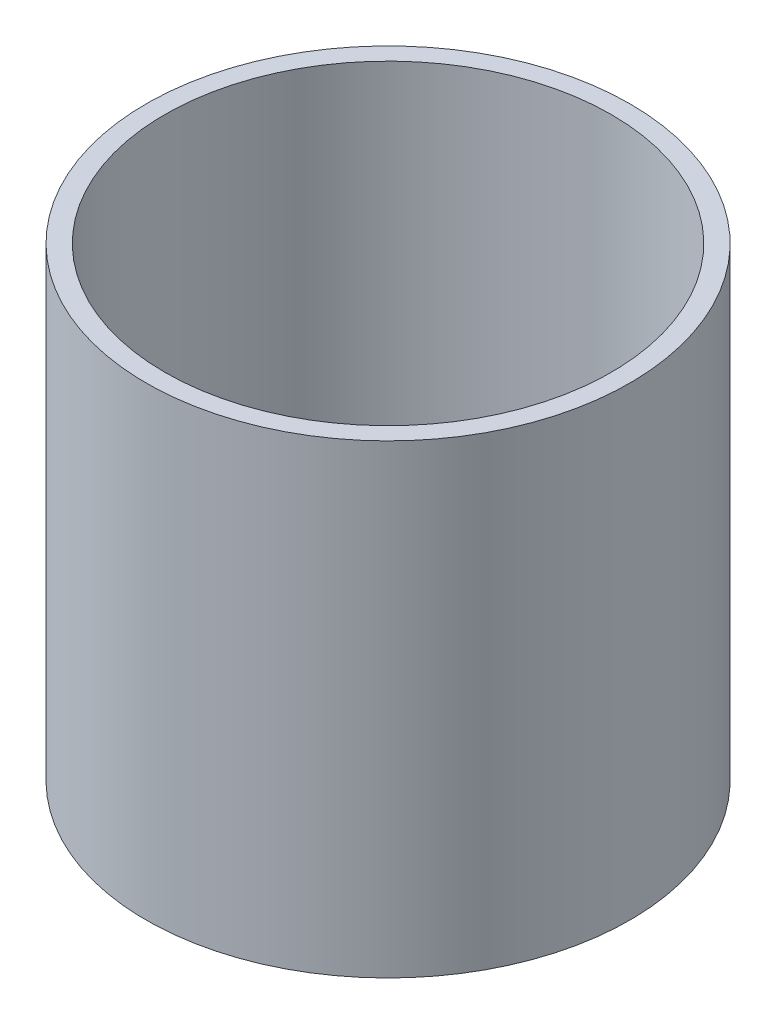
ISO-10303-21;
HEADER;
FILE_DESCRIPTION(('STEP AP214'),'2;1');
FILE_NAME('part.step','',(''),(''),'','','');
FILE_SCHEMA(('AUTOMOTIVE_DESIGN { 1 0 10303 214 1 1 1 1 }'));
ENDSEC;
DATA;
#1=APPLICATION_CONTEXT('core data for automotive mechanical design processes');
#2=APPLICATION_PROTOCOL_DEFINITION('international standard','automotive_design',2000,#1);
#3=PRODUCT_CONTEXT('',#1,'mechanical');
#4=PRODUCT('Part','Part','',(#3));
#5=PRODUCT_RELATED_PRODUCT_CATEGORY('part','',(#4));
#6=PRODUCT_DEFINITION_FORMATION('','',#4);
#7=PRODUCT_DEFINITION_CONTEXT('part definition',#1,'design');
#8=PRODUCT_DEFINITION('design','',#6,#7);
#9=PRODUCT_DEFINITION_SHAPE('','',#8);
#10=(LENGTH_UNIT() NAMED_UNIT(*) SI_UNIT(.MILLI.,.METRE.));
#11=(NAMED_UNIT(*) PLANE_ANGLE_UNIT() SI_UNIT($,.RADIAN.));
#12=(NAMED_UNIT(*) SI_UNIT($,.STERADIAN.) SOLID_ANGLE_UNIT());
#13=UNCERTAINTY_MEASURE_WITH_UNIT(LENGTH_MEASURE(1.E-05),#10,'distance_accuracy_value','');
#14=(GEOMETRIC_REPRESENTATION_CONTEXT(3) GLOBAL_UNCERTAINTY_ASSIGNED_CONTEXT((#13)) GLOBAL_UNIT_ASSIGNED_CONTEXT((#10,
#11,#12)) REPRESENTATION_CONTEXT('',''));
#15=CARTESIAN_POINT('',(0.,0.,0.));
#16=DIRECTION('',(0.,0.,1.));
#17=DIRECTION('',(1.,0.,0.));
#18=AXIS2_PLACEMENT_3D('',#15,#16,#17);
#19=CARTESIAN_POINT('',(0.,58.1915537161149,0.));
#20=DIRECTION('',(0.,-1.,0.));
#21=DIRECTION('',(0.,0.,-1.));
#22=AXIS2_PLACEMENT_3D('',#19,#20,#21);
#23=CYLINDRICAL_SURFACE('',#22,25.4);
#24=CARTESIAN_POINT('',(0.,58.1915537161149,0.));
#25=DIRECTION('',(0.,1.,0.));
#26=DIRECTION('',(0.,0.,1.));
#27=AXIS2_PLACEMENT_3D('',#24,#25,#26);
#28=CIRCLE('',#27,25.4);
#29=CARTESIAN_POINT('',(0.,58.1915537161149,-25.4));
#30=VERTEX_POINT('',#29);
#31=EDGE_CURVE('E10',#30,#30,#28,.T.);
#32=CARTESIAN_POINT('',(0.,9.345399869961,0.));
#33=DIRECTION('',(0.,1.,0.));
#34=DIRECTION('',(0.,0.,1.));
#35=AXIS2_PLACEMENT_3D('',#32,#33,#34);
#36=CIRCLE('',#35,25.4);
#37=CARTESIAN_POINT('',(0.,9.345399869961,-25.4));
#38=VERTEX_POINT('',#37);
#39=EDGE_CURVE('E41',#38,#38,#36,.T.);
#40=CARTESIAN_POINT('',(0.,58.1915537161149,-25.4));
#41=CARTESIAN_POINT('',(0.,57.6827396135508,-25.4));
#42=CARTESIAN_POINT('',(0.,57.1739255109866,-25.4));
#43=CARTESIAN_POINT('',(0.,56.1562973058584,-25.4));
#44=CARTESIAN_POINT('',(0.,55.6474832032943,-25.4));
#45=CARTESIAN_POINT('',(0.,54.6298549981661,-25.4));
#46=CARTESIAN_POINT('',(0.,54.121040895602,-25.4));
#47=CARTESIAN_POINT('',(0.,53.1034126904738,-25.4));
#48=CARTESIAN_POINT('',(0.,52.5945985879097,-25.4));
#49=CARTESIAN_POINT('',(0.,51.5769703827815,-25.4));
#50=CARTESIAN_POINT('',(0.,51.0681562802174,-25.4));
#51=CARTESIAN_POINT('',(0.,50.0505280750892,-25.4));
#52=CARTESIAN_POINT('',(0.,49.5417139725251,-25.4));
#53=CARTESIAN_POINT('',(0.,48.5240857673969,-25.4));
#54=CARTESIAN_POINT('',(0.,48.0152716648328,-25.4));
#55=CARTESIAN_POINT('',(0.,46.9976434597046,-25.4));
#56=CARTESIAN_POINT('',(0.,46.4888293571405,-25.4));
#57=CARTESIAN_POINT('',(0.,45.4712011520123,-25.4));
#58=CARTESIAN_POINT('',(0.,44.9623870494482,-25.4));
#59=CARTESIAN_POINT('',(0.,43.94475884432,-25.4));
#60=CARTESIAN_POINT('',(0.,43.4359447417559,-25.4));
#61=CARTESIAN_POINT('',(0.,42.4183165366277,-25.4));
#62=CARTESIAN_POINT('',(0.,41.9095024340636,-25.4));
#63=CARTESIAN_POINT('',(0.,40.8918742289354,-25.4));
#64=CARTESIAN_POINT('',(0.,40.3830601263713,-25.4));
#65=CARTESIAN_POINT('',(0.,39.3654319212431,-25.4));
#66=CARTESIAN_POINT('',(0.,38.856617818679,-25.4));
#67=CARTESIAN_POINT('',(0.,37.8389896135508,-25.4));
#68=CARTESIAN_POINT('',(0.,37.3301755109866,-25.4));
#69=CARTESIAN_POINT('',(0.,36.3125473058584,-25.4));
#70=CARTESIAN_POINT('',(0.,35.8037332032943,-25.4));
#71=CARTESIAN_POINT('',(0.,34.7861049981661,-25.4));
#72=CARTESIAN_POINT('',(0.,34.277290895602,-25.4));
#73=CARTESIAN_POINT('',(0.,33.2596626904738,-25.4));
#74=CARTESIAN_POINT('',(0.,32.7508485879097,-25.4));
#75=CARTESIAN_POINT('',(0.,31.7332203827815,-25.4));
#76=CARTESIAN_POINT('',(0.,31.2244062802174,-25.4));
#77=CARTESIAN_POINT('',(0.,30.2067780750892,-25.4));
#78=CARTESIAN_POINT('',(0.,29.6979639725251,-25.4));
#79=CARTESIAN_POINT('',(0.,28.6803357673969,-25.4));
#80=CARTESIAN_POINT('',(0.,28.1715216648328,-25.4));
#81=CARTESIAN_POINT('',(0.,27.1538934597046,-25.4));
#82=CARTESIAN_POINT('',(0.,26.6450793571405,-25.4));
#83=CARTESIAN_POINT('',(0.,25.6274511520123,-25.4));
#84=CARTESIAN_POINT('',(0.,25.1186370494482,-25.4));
#85=CARTESIAN_POINT('',(0.,24.10100884432,-25.4));
#86=CARTESIAN_POINT('',(0.,23.5921947417559,-25.4));
#87=CARTESIAN_POINT('',(0.,22.5745665366277,-25.4));
#88=CARTESIAN_POINT('',(0.,22.0657524340636,-25.4));
#89=CARTESIAN_POINT('',(0.,21.0481242289354,-25.4));
#90=CARTESIAN_POINT('',(0.,20.5393101263713,-25.4));
#91=CARTESIAN_POINT('',(0.,19.5216819212431,-25.4));
#92=CARTESIAN_POINT('',(0.,19.012867818679,-25.4));
#93=CARTESIAN_POINT('',(0.,17.9952396135508,-25.4));
#94=CARTESIAN_POINT('',(0.,17.4864255109866,-25.4));
#95=CARTESIAN_POINT('',(0.,16.4687973058584,-25.4));
#96=CARTESIAN_POINT('',(0.,15.9599832032943,-25.4));
#97=CARTESIAN_POINT('',(0.,14.9423549981661,-25.4));
#98=CARTESIAN_POINT('',(0.,14.433540895602,-25.4));
#99=CARTESIAN_POINT('',(0.,13.4159126904738,-25.4));
#100=CARTESIAN_POINT('',(0.,12.9070985879097,-25.4));
#101=CARTESIAN_POINT('',(0.,11.8894703827815,-25.4));
#102=CARTESIAN_POINT('',(0.,11.3806562802174,-25.4));
#103=CARTESIAN_POINT('',(0.,10.3630280750892,-25.4));
#104=CARTESIAN_POINT('',(0.,9.8542139725251,-25.4));
#105=CARTESIAN_POINT('',(0.,9.345399869961,-25.4));
#106=B_SPLINE_CURVE_WITH_KNOTS('',3,(#40,#41,#42,#43,#44,#45,#46,#47,#48,#49,#50,#51,#52,#53,
#54,#55,#56,#57,#58,#59,#60,#61,#62,#63,#64,#65,#66,#67,#68,#69,#70,#71,#72,#73,#74,#75,#76,#77,
#78,#79,#80,#81,#82,#83,#84,#85,#86,#87,#88,#89,#90,#91,#92,#93,#94,#95,#96,#97,#98,#99,#100,
#101,#102,#103,#104,#105),.UNSPECIFIED.,.F.,.F.,(4,2,2,2,2,2,2,2,2,2,2,2,2,2,2,2,2,2,2,2,2,2,2,
2,2,2,2,2,2,2,2,2,4),(0.,1.52644230769231,3.05288461538462,4.57932692307693,6.10576923076923,
7.63221153846155,9.15865384615385,10.6850961538462,12.2115384615385,13.7379807692308,
15.2644230769231,16.7908653846154,18.3173076923077,19.84375,21.3701923076923,22.8966346153846,
24.4230769230769,25.9495192307692,27.4759615384615,29.0024038461539,30.5288461538462,
32.0552884615385,33.5817307692308,35.1081730769231,36.6346153846154,38.1610576923077,39.6875,
41.2139423076923,42.7403846153846,44.2668269230769,45.7932692307692,47.3197115384615,
48.8461538461539),.UNSPECIFIED.);
#107=EDGE_CURVE('BSEAM34',#30,#38,#106,.T.);
#108=ORIENTED_EDGE('',*,*,#31,.F.);
#109=ORIENTED_EDGE('',*,*,#39,.T.);
#110=ORIENTED_EDGE('',*,*,#107,.T.);
#111=ORIENTED_EDGE('',*,*,#107,.F.);
#112=EDGE_LOOP('',(#108,#110,#109,#111));
#113=FACE_BOUND('',#112,.T.);
#114=ADVANCED_FACE('F34',(#113),#23,.T.);
#115=CARTESIAN_POINT('',(0.,58.1915537161149,0.));
#116=DIRECTION('',(0.,1.,0.));
#117=DIRECTION('',(0.,0.,1.));
#118=AXIS2_PLACEMENT_3D('',#115,#116,#117);
#119=PLANE('',#118);
#120=CARTESIAN_POINT('',(0.,58.1915537161149,0.));
#121=DIRECTION('',(0.,1.,0.));
#122=DIRECTION('',(0.,0.,1.));
#123=AXIS2_PLACEMENT_3D('',#120,#121,#122);
#124=CIRCLE('',#123,23.4461538461538);
#125=CARTESIAN_POINT('',(0.,58.1915537161149,-23.4461538461538));
#126=VERTEX_POINT('',#125);
#127=EDGE_CURVE('E45',#126,#126,#124,.T.);
#128=ORIENTED_EDGE('',*,*,#127,.F.);
#129=EDGE_LOOP('',(#128));
#130=FACE_BOUND('',#129,.T.);
#131=ORIENTED_EDGE('',*,*,#31,.T.);
#132=EDGE_LOOP('',(#131));
#133=FACE_BOUND('',#132,.T.);
#134=ADVANCED_FACE('F66',(#130,#133),#119,.T.);
#135=CARTESIAN_POINT('',(0.,9.345399869961,0.));
#136=DIRECTION('',(0.,1.,0.));
#137=DIRECTION('',(0.,0.,1.));
#138=AXIS2_PLACEMENT_3D('',#135,#136,#137);
#139=PLANE('',#138);
#140=ORIENTED_EDGE('',*,*,#39,.F.);
#141=EDGE_LOOP('',(#140));
#142=FACE_BOUND('',#141,.T.);
#143=ADVANCED_FACE('F36',(#142),#139,.F.);
#144=CARTESIAN_POINT('',(0.,58.1915537161149,0.));
#145=DIRECTION('',(0.,-1.,0.));
#146=DIRECTION('',(0.,0.,-1.));
#147=AXIS2_PLACEMENT_3D('',#144,#145,#146);
#148=CYLINDRICAL_SURFACE('',#147,23.4461538461538);
#149=CARTESIAN_POINT('',(0.,11.2992460238072,0.));
#150=DIRECTION('',(0.,1.,0.));
#151=DIRECTION('',(0.,0.,1.));
#152=AXIS2_PLACEMENT_3D('',#149,#150,#151);
#153=CIRCLE('',#152,23.4461538461538);
#154=CARTESIAN_POINT('',(0.,11.2992460238072,-23.4461538461538));
#155=VERTEX_POINT('',#154);
#156=EDGE_CURVE('E49',#155,#155,#153,.T.);
#157=CARTESIAN_POINT('',(0.,58.1915537161149,-23.4461538461538));
#158=CARTESIAN_POINT('',(0.,57.7030921776533,-23.4461538461538));
#159=CARTESIAN_POINT('',(0.,57.2146306391918,-23.4461538461538));
#160=CARTESIAN_POINT('',(0.,56.2377075622687,-23.4461538461538));
#161=CARTESIAN_POINT('',(0.,55.7492460238072,-23.4461538461538));
#162=CARTESIAN_POINT('',(0.,54.7723229468841,-23.4461538461538));
#163=CARTESIAN_POINT('',(0.,54.2838614084225,-23.4461538461538));
#164=CARTESIAN_POINT('',(0.,53.3069383314995,-23.4461538461538));
#165=CARTESIAN_POINT('',(0.,52.8184767930379,-23.4461538461538));
#166=CARTESIAN_POINT('',(0.,51.8415537161149,-23.4461538461538));
#167=CARTESIAN_POINT('',(0.,51.3530921776533,-23.4461538461538));
#168=CARTESIAN_POINT('',(0.,50.3761691007302,-23.4461538461538));
#169=CARTESIAN_POINT('',(0.,49.8877075622687,-23.4461538461538));
#170=CARTESIAN_POINT('',(0.,48.9107844853456,-23.4461538461538));
#171=CARTESIAN_POINT('',(0.,48.4223229468841,-23.4461538461538));
#172=CARTESIAN_POINT('',(0.,47.445399869961,-23.4461538461538));
#173=CARTESIAN_POINT('',(0.,46.9569383314995,-23.4461538461538));
#174=CARTESIAN_POINT('',(0.,45.9800152545764,-23.4461538461538));
#175=CARTESIAN_POINT('',(0.,45.4915537161149,-23.4461538461538));
#176=CARTESIAN_POINT('',(0.,44.5146306391918,-23.4461538461538));
#177=CARTESIAN_POINT('',(0.,44.0261691007302,-23.4461538461538));
#178=CARTESIAN_POINT('',(0.,43.0492460238072,-23.4461538461538));
#179=CARTESIAN_POINT('',(0.,42.5607844853456,-23.4461538461538));
#180=CARTESIAN_POINT('',(0.,41.5838614084225,-23.4461538461538));
#181=CARTESIAN_POINT('',(0.,41.095399869961,-23.4461538461538));
#182=CARTESIAN_POINT('',(0.,40.1184767930379,-23.4461538461538));
#183=CARTESIAN_POINT('',(0.,39.6300152545764,-23.4461538461538));
#184=CARTESIAN_POINT('',(0.,38.6530921776533,-23.4461538461538));
#185=CARTESIAN_POINT('',(0.,38.1646306391918,-23.4461538461538));
#186=CARTESIAN_POINT('',(0.,37.1877075622687,-23.4461538461538));
#187=CARTESIAN_POINT('',(0.,36.6992460238072,-23.4461538461538));
#188=CARTESIAN_POINT('',(0.,35.7223229468841,-23.4461538461538));
#189=CARTESIAN_POINT('',(0.,35.2338614084225,-23.4461538461538));
#190=CARTESIAN_POINT('',(0.,34.2569383314995,-23.4461538461538));
#191=CARTESIAN_POINT('',(0.,33.7684767930379,-23.4461538461538));
#192=CARTESIAN_POINT('',(0.,32.7915537161148,-23.4461538461538));
#193=CARTESIAN_POINT('',(0.,32.3030921776533,-23.4461538461538));
#194=CARTESIAN_POINT('',(0.,31.3261691007302,-23.4461538461538));
#195=CARTESIAN_POINT('',(0.,30.8377075622687,-23.4461538461538));
#196=CARTESIAN_POINT('',(0.,29.8607844853456,-23.4461538461538));
#197=CARTESIAN_POINT('',(0.,29.3723229468841,-23.4461538461538));
#198=CARTESIAN_POINT('',(0.,28.395399869961,-23.4461538461538));
#199=CARTESIAN_POINT('',(0.,27.9069383314995,-23.4461538461538));
#200=CARTESIAN_POINT('',(0.,26.9300152545764,-23.4461538461538));
#201=CARTESIAN_POINT('',(0.,26.4415537161148,-23.4461538461538));
#202=CARTESIAN_POINT('',(0.,25.4646306391918,-23.4461538461538));
#203=CARTESIAN_POINT('',(0.,24.9761691007302,-23.4461538461538));
#204=CARTESIAN_POINT('',(0.,23.9992460238072,-23.4461538461538));
#205=CARTESIAN_POINT('',(0.,23.5107844853456,-23.4461538461538));
#206=CARTESIAN_POINT('',(0.,22.5338614084225,-23.4461538461538));
#207=CARTESIAN_POINT('',(0.,22.045399869961,-23.4461538461538));
#208=CARTESIAN_POINT('',(0.,21.0684767930379,-23.4461538461538));
#209=CARTESIAN_POINT('',(0.,20.5800152545764,-23.4461538461538));
#210=CARTESIAN_POINT('',(0.,19.6030921776533,-23.4461538461538));
#211=CARTESIAN_POINT('',(0.,19.1146306391918,-23.4461538461538));
#212=CARTESIAN_POINT('',(0.,18.1377075622687,-23.4461538461538));
#213=CARTESIAN_POINT('',(0.,17.6492460238072,-23.4461538461538));
#214=CARTESIAN_POINT('',(0.,16.6723229468841,-23.4461538461538));
#215=CARTESIAN_POINT('',(0.,16.1838614084225,-23.4461538461538));
#216=CARTESIAN_POINT('',(0.,15.2069383314995,-23.4461538461538));
#217=CARTESIAN_POINT('',(0.,14.7184767930379,-23.4461538461538));
#218=CARTESIAN_POINT('',(0.,13.7415537161149,-23.4461538461538));
#219=CARTESIAN_POINT('',(0.,13.2530921776533,-23.4461538461538));
#220=CARTESIAN_POINT('',(0.,12.2761691007302,-23.4461538461538));
#221=CARTESIAN_POINT('',(0.,11.7877075622687,-23.4461538461538));
#222=CARTESIAN_POINT('',(0.,11.2992460238072,-23.4461538461538));
#223=B_SPLINE_CURVE_WITH_KNOTS('',3,(#157,#158,#159,#160,#161,#162,#163,#164,#165,#166,#167,
#168,#169,#170,#171,#172,#173,#174,#175,#176,#177,#178,#179,#180,#181,#182,#183,#184,#185,#186,
#187,#188,#189,#190,#191,#192,#193,#194,#195,#196,#197,#198,#199,#200,#201,#202,#203,#204,#205,
#206,#207,#208,#209,#210,#211,#212,#213,#214,#215,#216,#217,#218,#219,#220,#221,#222),
.UNSPECIFIED.,.F.,.F.,(4,2,2,2,2,2,2,2,2,2,2,2,2,2,2,2,2,2,2,2,2,2,2,2,2,2,2,2,2,2,2,2,4),(0.,
1.46538461538462,2.93076923076924,4.39615384615385,5.86153846153847,7.32692307692308,
8.7923076923077,10.2576923076923,11.7230769230769,13.1884615384615,14.6538461538462,
16.1192307692308,17.5846153846154,19.05,20.5153846153846,21.9807692307692,23.4461538461539,
24.9115384615385,26.3769230769231,27.8423076923077,29.3076923076923,30.7730769230769,
32.2384615384615,33.7038461538462,35.1692307692308,36.6346153846154,38.1,39.5653846153846,
41.0307692307692,42.4961538461539,43.9615384615385,45.4269230769231,46.8923076923077),.UNSPECIFIED.);
#224=EDGE_CURVE('BSEAM57',#126,#155,#223,.T.);
#225=ORIENTED_EDGE('',*,*,#127,.T.);
#226=ORIENTED_EDGE('',*,*,#156,.F.);
#227=ORIENTED_EDGE('',*,*,#224,.T.);
#228=ORIENTED_EDGE('',*,*,#224,.F.);
#229=EDGE_LOOP('',(#225,#227,#226,#228));
#230=FACE_BOUND('',#229,.T.);
#231=ADVANCED_FACE('F57',(#230),#148,.F.);
#232=CARTESIAN_POINT('',(0.,11.2992460238072,0.));
#233=DIRECTION('',(0.,1.,0.));
#234=DIRECTION('',(0.,0.,1.));
#235=AXIS2_PLACEMENT_3D('',#232,#233,#234);
#236=PLANE('',#235);
#237=ORIENTED_EDGE('',*,*,#156,.T.);
#238=EDGE_LOOP('',(#237));
#239=FACE_BOUND('',#238,.T.);
#240=ADVANCED_FACE('F55',(#239),#236,.T.);
#241=CLOSED_SHELL('',(#114,#134,#143,#231,#240));
#242=MANIFOLD_SOLID_BREP('B2',#241);
#243=ADVANCED_BREP_SHAPE_REPRESENTATION('',(#18,#242),#14);
#244=SHAPE_DEFINITION_REPRESENTATION(#9,#243);
ENDSEC;
END-ISO-10303-21;
